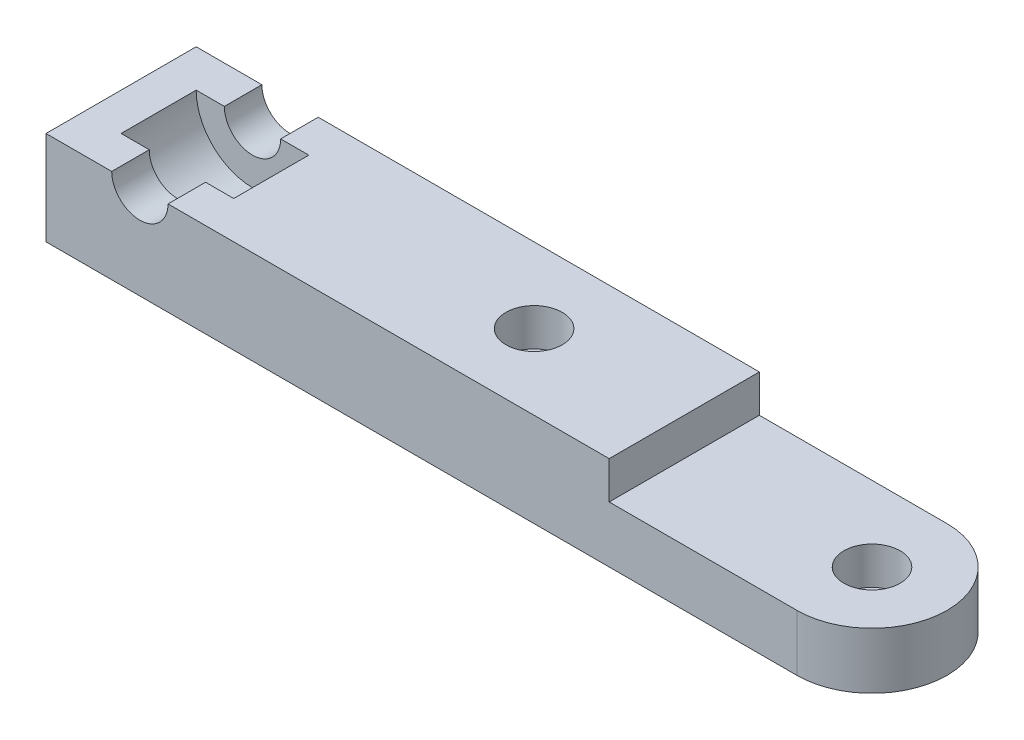
ISO-10303-21;
HEADER;
FILE_DESCRIPTION(('STEP AP214'),'2;1');
FILE_NAME('part.step','',(''),(''),'','','');
FILE_SCHEMA(('AUTOMOTIVE_DESIGN { 1 0 10303 214 1 1 1 1 }'));
ENDSEC;
DATA;
#1=APPLICATION_CONTEXT('core data for automotive mechanical design processes');
#2=APPLICATION_PROTOCOL_DEFINITION('international standard','automotive_design',2000,#1);
#3=PRODUCT_CONTEXT('',#1,'mechanical');
#4=PRODUCT('Part','Part','',(#3));
#5=PRODUCT_RELATED_PRODUCT_CATEGORY('part','',(#4));
#6=PRODUCT_DEFINITION_FORMATION('','',#4);
#7=PRODUCT_DEFINITION_CONTEXT('part definition',#1,'design');
#8=PRODUCT_DEFINITION('design','',#6,#7);
#9=PRODUCT_DEFINITION_SHAPE('','',#8);
#10=(LENGTH_UNIT() NAMED_UNIT(*) SI_UNIT(.MILLI.,.METRE.));
#11=(NAMED_UNIT(*) PLANE_ANGLE_UNIT() SI_UNIT($,.RADIAN.));
#12=(NAMED_UNIT(*) SI_UNIT($,.STERADIAN.) SOLID_ANGLE_UNIT());
#13=UNCERTAINTY_MEASURE_WITH_UNIT(LENGTH_MEASURE(1.E-05),#10,'distance_accuracy_value','');
#14=(GEOMETRIC_REPRESENTATION_CONTEXT(3) GLOBAL_UNCERTAINTY_ASSIGNED_CONTEXT((#13)) GLOBAL_UNIT_ASSIGNED_CONTEXT((#10,
#11,#12)) REPRESENTATION_CONTEXT('',''));
#15=CARTESIAN_POINT('',(0.,0.,0.));
#16=DIRECTION('',(0.,0.,1.));
#17=DIRECTION('',(1.,0.,0.));
#18=AXIS2_PLACEMENT_3D('',#15,#16,#17);
#19=CARTESIAN_POINT('',(30.,5.,-4.00004999999999));
#20=DIRECTION('',(0.,0.,1.));
#21=DIRECTION('',(1.,0.,0.));
#22=AXIS2_PLACEMENT_3D('',#19,#20,#21);
#23=CYLINDRICAL_SURFACE('',#22,1.5);
#24=CARTESIAN_POINT('',(30.,5.,-2.));
#25=DIRECTION('',(0.,0.,1.));
#26=DIRECTION('',(1.,0.,0.));
#27=AXIS2_PLACEMENT_3D('',#24,#25,#26);
#28=CIRCLE('',#27,1.5);
#29=CARTESIAN_POINT('',(31.5,5.,-2.));
#30=VERTEX_POINT('',#29);
#31=CARTESIAN_POINT('',(28.5,5.,-2.));
#32=VERTEX_POINT('',#31);
#33=EDGE_CURVE('E43',#30,#32,#28,.F.);
#34=ORIENTED_EDGE('',*,*,#33,.F.);
#35=DIRECTION('',(0.,0.,1.));
#36=VECTOR('',#35,1.);
#37=CARTESIAN_POINT('',(31.5,5.,-4.00004999999999));
#38=LINE('',#37,#36);
#39=CARTESIAN_POINT('',(31.5,5.,-3.99999999999999));
#40=VERTEX_POINT('',#39);
#41=EDGE_CURVE('E145',#30,#40,#38,.F.);
#42=ORIENTED_EDGE('',*,*,#41,.T.);
#43=CARTESIAN_POINT('',(30.,5.,-4.));
#44=DIRECTION('',(0.,0.,1.));
#45=DIRECTION('',(1.,0.,0.));
#46=AXIS2_PLACEMENT_3D('',#43,#44,#45);
#47=CIRCLE('',#46,1.5);
#48=CARTESIAN_POINT('',(28.5,5.,-3.99999999999999));
#49=VERTEX_POINT('',#48);
#50=EDGE_CURVE('E155',#49,#40,#47,.T.);
#51=ORIENTED_EDGE('',*,*,#50,.F.);
#52=DIRECTION('',(0.,0.,1.));
#53=VECTOR('',#52,1.);
#54=CARTESIAN_POINT('',(28.5,5.,-4.00004999999999));
#55=LINE('',#54,#53);
#56=EDGE_CURVE('E196',#49,#32,#55,.T.);
#57=ORIENTED_EDGE('',*,*,#56,.T.);
#58=EDGE_LOOP('',(#34,#42,#51,#57));
#59=FACE_BOUND('',#58,.T.);
#60=ADVANCED_FACE('F35',(#59),#23,.F.);
#61=CARTESIAN_POINT('',(0.,5.,0.));
#62=DIRECTION('',(0.,1.,0.));
#63=DIRECTION('',(0.,0.,1.));
#64=AXIS2_PLACEMENT_3D('',#61,#62,#63);
#65=PLANE('',#64);
#66=DIRECTION('',(-1.,0.,0.));
#67=VECTOR('',#66,1.);
#68=CARTESIAN_POINT('',(27.,5.,2.));
#69=LINE('',#68,#67);
#70=CARTESIAN_POINT('',(28.5,5.,2.));
#71=VERTEX_POINT('',#70);
#72=CARTESIAN_POINT('',(27.,5.,2.));
#73=VERTEX_POINT('',#72);
#74=EDGE_CURVE('E147',#71,#73,#69,.T.);
#75=ORIENTED_EDGE('',*,*,#74,.T.);
#76=DIRECTION('',(0.,0.,-1.));
#77=VECTOR('',#76,1.);
#78=CARTESIAN_POINT('',(27.,5.,2.));
#79=LINE('',#78,#77);
#80=CARTESIAN_POINT('',(27.,5.,-2.));
#81=VERTEX_POINT('',#80);
#82=EDGE_CURVE('E135',#73,#81,#79,.T.);
#83=ORIENTED_EDGE('',*,*,#82,.T.);
#84=DIRECTION('',(-1.,0.,0.));
#85=VECTOR('',#84,1.);
#86=CARTESIAN_POINT('',(27.,5.,-2.));
#87=LINE('',#86,#85);
#88=EDGE_CURVE('E139',#32,#81,#87,.T.);
#89=ORIENTED_EDGE('',*,*,#88,.F.);
#90=ORIENTED_EDGE('',*,*,#56,.F.);
#91=DIRECTION('',(-1.,0.,0.));
#92=VECTOR('',#91,1.);
#93=CARTESIAN_POINT('',(25.,5.,-3.99999999999999));
#94=LINE('',#93,#92);
#95=CARTESIAN_POINT('',(25.,5.,-3.99999999999999));
#96=VERTEX_POINT('',#95);
#97=EDGE_CURVE('E168',#49,#96,#94,.T.);
#98=ORIENTED_EDGE('',*,*,#97,.T.);
#99=DIRECTION('',(0.,0.,1.));
#100=VECTOR('',#99,1.);
#101=CARTESIAN_POINT('',(25.,5.,-3.99999999999999));
#102=LINE('',#101,#100);
#103=CARTESIAN_POINT('',(25.,5.,4.));
#104=VERTEX_POINT('',#103);
#105=EDGE_CURVE('E159',#96,#104,#102,.T.);
#106=ORIENTED_EDGE('',*,*,#105,.T.);
#107=DIRECTION('',(1.,0.,0.));
#108=VECTOR('',#107,1.);
#109=CARTESIAN_POINT('',(25.,5.,4.));
#110=LINE('',#109,#108);
#111=CARTESIAN_POINT('',(28.5,5.,4.));
#112=VERTEX_POINT('',#111);
#113=EDGE_CURVE('E163',#104,#112,#110,.T.);
#114=ORIENTED_EDGE('',*,*,#113,.T.);
#115=EDGE_CURVE('E195',#71,#112,#55,.T.);
#116=ORIENTED_EDGE('',*,*,#115,.F.);
#117=EDGE_LOOP('',(#75,#83,#89,#90,#98,#106,#114,#116));
#118=FACE_BOUND('',#117,.T.);
#119=ADVANCED_FACE('F202',(#118),#65,.T.);
#120=CARTESIAN_POINT('',(25.,3.,-3.99999999999999));
#121=DIRECTION('',(1.,0.,0.));
#122=DIRECTION('',(0.,0.,-1.));
#123=AXIS2_PLACEMENT_3D('',#120,#121,#122);
#124=PLANE('',#123);
#125=DIRECTION('',(0.,0.,1.));
#126=VECTOR('',#125,1.);
#127=CARTESIAN_POINT('',(25.,0.,-3.99999999999999));
#128=LINE('',#127,#126);
#129=CARTESIAN_POINT('',(25.,0.,-3.99999999999999));
#130=VERTEX_POINT('',#129);
#131=CARTESIAN_POINT('',(25.,0.,4.));
#132=VERTEX_POINT('',#131);
#133=EDGE_CURVE('E190',#130,#132,#128,.T.);
#134=ORIENTED_EDGE('',*,*,#133,.T.);
#135=DIRECTION('',(0.,-1.,0.));
#136=VECTOR('',#135,1.);
#137=CARTESIAN_POINT('',(25.,3.,4.));
#138=LINE('',#137,#136);
#139=EDGE_CURVE('E240',#104,#132,#138,.T.);
#140=ORIENTED_EDGE('',*,*,#139,.F.);
#141=ORIENTED_EDGE('',*,*,#105,.F.);
#142=DIRECTION('',(0.,-1.,0.));
#143=VECTOR('',#142,1.);
#144=CARTESIAN_POINT('',(25.,3.,-3.99999999999999));
#145=LINE('',#144,#143);
#146=EDGE_CURVE('E220',#96,#130,#145,.T.);
#147=ORIENTED_EDGE('',*,*,#146,.T.);
#148=EDGE_LOOP('',(#134,#140,#141,#147));
#149=FACE_BOUND('',#148,.T.);
#150=ADVANCED_FACE('F37',(#149),#124,.F.);
#151=CARTESIAN_POINT('',(25.,3.,4.));
#152=DIRECTION('',(0.,0.,-1.));
#153=DIRECTION('',(-1.,0.,0.));
#154=AXIS2_PLACEMENT_3D('',#151,#152,#153);
#155=PLANE('',#154);
#156=CARTESIAN_POINT('',(31.5,5.,4.));
#157=VERTEX_POINT('',#156);
#158=CARTESIAN_POINT('',(55.,5.,4.));
#159=VERTEX_POINT('',#158);
#160=EDGE_CURVE('E162',#157,#159,#110,.T.);
#161=ORIENTED_EDGE('',*,*,#160,.F.);
#162=CARTESIAN_POINT('',(30.,5.,4.));
#163=DIRECTION('',(0.,0.,1.));
#164=DIRECTION('',(-1.,0.,0.));
#165=AXIS2_PLACEMENT_3D('',#162,#163,#164);
#166=CIRCLE('',#165,1.5);
#167=EDGE_CURVE('E58',#112,#157,#166,.T.);
#168=ORIENTED_EDGE('',*,*,#167,.F.);
#169=ORIENTED_EDGE('',*,*,#113,.F.);
#170=ORIENTED_EDGE('',*,*,#139,.T.);
#171=DIRECTION('',(1.,0.,0.));
#172=VECTOR('',#171,1.);
#173=CARTESIAN_POINT('',(25.,0.,4.));
#174=LINE('',#173,#172);
#175=CARTESIAN_POINT('',(65.,0.,4.));
#176=VERTEX_POINT('',#175);
#177=EDGE_CURVE('E231',#132,#176,#174,.T.);
#178=ORIENTED_EDGE('',*,*,#177,.T.);
#179=DIRECTION('',(0.,-1.,0.));
#180=VECTOR('',#179,1.);
#181=CARTESIAN_POINT('',(65.,3.,4.));
#182=LINE('',#181,#180);
#183=CARTESIAN_POINT('',(65.,3.,4.));
#184=VERTEX_POINT('',#183);
#185=EDGE_CURVE('E237',#184,#176,#182,.T.);
#186=ORIENTED_EDGE('',*,*,#185,.F.);
#187=DIRECTION('',(1.,0.,0.));
#188=VECTOR('',#187,1.);
#189=CARTESIAN_POINT('',(25.,3.,4.));
#190=LINE('',#189,#188);
#191=CARTESIAN_POINT('',(55.,3.,4.));
#192=VERTEX_POINT('',#191);
#193=EDGE_CURVE('E224',#192,#184,#190,.T.);
#194=ORIENTED_EDGE('',*,*,#193,.F.);
#195=DIRECTION('',(0.,-1.,0.));
#196=VECTOR('',#195,1.);
#197=CARTESIAN_POINT('',(55.,5.,4.));
#198=LINE('',#197,#196);
#199=EDGE_CURVE('E185',#159,#192,#198,.T.);
#200=ORIENTED_EDGE('',*,*,#199,.F.);
#201=EDGE_LOOP('',(#161,#168,#169,#170,#178,#186,#194,#200));
#202=FACE_BOUND('',#201,.T.);
#203=ADVANCED_FACE('F244',(#202),#155,.F.);
#204=CARTESIAN_POINT('',(65.,3.,0.));
#205=DIRECTION('',(0.,-1.,0.));
#206=DIRECTION('',(0.,0.,-1.));
#207=AXIS2_PLACEMENT_3D('',#204,#205,#206);
#208=CYLINDRICAL_SURFACE('',#207,4.);
#209=CARTESIAN_POINT('',(65.,0.,0.));
#210=DIRECTION('',(0.,1.,0.));
#211=DIRECTION('',(0.,0.,1.));
#212=AXIS2_PLACEMENT_3D('',#209,#210,#211);
#213=CIRCLE('',#212,4.);
#214=CARTESIAN_POINT('',(65.,0.,-4.));
#215=VERTEX_POINT('',#214);
#216=EDGE_CURVE('E233',#176,#215,#213,.T.);
#217=ORIENTED_EDGE('',*,*,#216,.T.);
#218=DIRECTION('',(0.,-1.,0.));
#219=VECTOR('',#218,1.);
#220=CARTESIAN_POINT('',(65.,3.,-4.));
#221=LINE('',#220,#219);
#222=CARTESIAN_POINT('',(65.,3.,-4.));
#223=VERTEX_POINT('',#222);
#224=EDGE_CURVE('E217',#223,#215,#221,.T.);
#225=ORIENTED_EDGE('',*,*,#224,.F.);
#226=CARTESIAN_POINT('',(65.,3.,0.));
#227=DIRECTION('',(0.,1.,0.));
#228=DIRECTION('',(0.,0.,1.));
#229=AXIS2_PLACEMENT_3D('',#226,#227,#228);
#230=CIRCLE('',#229,4.);
#231=EDGE_CURVE('E221',#184,#223,#230,.T.);
#232=ORIENTED_EDGE('',*,*,#231,.F.);
#233=ORIENTED_EDGE('',*,*,#185,.T.);
#234=EDGE_LOOP('',(#217,#225,#232,#233));
#235=FACE_BOUND('',#234,.T.);
#236=ADVANCED_FACE('F253',(#235),#208,.T.);
#237=CARTESIAN_POINT('',(65.,3.,-4.));
#238=DIRECTION('',(0.,0.,1.));
#239=DIRECTION('',(1.,0.,0.));
#240=AXIS2_PLACEMENT_3D('',#237,#238,#239);
#241=PLANE('',#240);
#242=ORIENTED_EDGE('',*,*,#97,.F.);
#243=ORIENTED_EDGE('',*,*,#50,.T.);
#244=CARTESIAN_POINT('',(55.,5.,-3.99999999999999));
#245=VERTEX_POINT('',#244);
#246=EDGE_CURVE('E169',#245,#40,#94,.T.);
#247=ORIENTED_EDGE('',*,*,#246,.F.);
#248=DIRECTION('',(0.,-1.,0.));
#249=VECTOR('',#248,1.);
#250=CARTESIAN_POINT('',(55.,5.,-3.99999999999999));
#251=LINE('',#250,#249);
#252=CARTESIAN_POINT('',(55.,3.,-3.99999999999999));
#253=VERTEX_POINT('',#252);
#254=EDGE_CURVE('E171',#245,#253,#251,.T.);
#255=ORIENTED_EDGE('',*,*,#254,.T.);
#256=DIRECTION('',(-1.,0.,0.));
#257=VECTOR('',#256,1.);
#258=CARTESIAN_POINT('',(65.,3.,-4.));
#259=LINE('',#258,#257);
#260=EDGE_CURVE('E180',#223,#253,#259,.T.);
#261=ORIENTED_EDGE('',*,*,#260,.F.);
#262=ORIENTED_EDGE('',*,*,#224,.T.);
#263=DIRECTION('',(-1.,0.,0.));
#264=VECTOR('',#263,1.);
#265=CARTESIAN_POINT('',(65.,0.,-4.));
#266=LINE('',#265,#264);
#267=EDGE_CURVE('E226',#215,#130,#266,.T.);
#268=ORIENTED_EDGE('',*,*,#267,.T.);
#269=ORIENTED_EDGE('',*,*,#146,.F.);
#270=EDGE_LOOP('',(#242,#243,#247,#255,#261,#262,#268,#269));
#271=FACE_BOUND('',#270,.T.);
#272=ADVANCED_FACE('F206',(#271),#241,.F.);
#273=CARTESIAN_POINT('',(65.,3.,0.));
#274=DIRECTION('',(0.,1.,0.));
#275=DIRECTION('',(0.,0.,1.));
#276=AXIS2_PLACEMENT_3D('',#273,#274,#275);
#277=PLANE('',#276);
#278=CARTESIAN_POINT('',(65.,3.,0.));
#279=DIRECTION('',(0.,1.,0.));
#280=DIRECTION('',(0.,0.,1.));
#281=AXIS2_PLACEMENT_3D('',#278,#279,#280);
#282=CIRCLE('',#281,1.5);
#283=CARTESIAN_POINT('',(65.,3.,1.5));
#284=VERTEX_POINT('',#283);
#285=EDGE_CURVE('E295',#284,#284,#282,.T.);
#286=ORIENTED_EDGE('',*,*,#285,.F.);
#287=EDGE_LOOP('',(#286));
#288=FACE_BOUND('',#287,.T.);
#289=DIRECTION('',(0.,0.,-1.));
#290=VECTOR('',#289,1.);
#291=CARTESIAN_POINT('',(55.,3.,-3.99999999999999));
#292=LINE('',#291,#290);
#293=EDGE_CURVE('E158',#192,#253,#292,.T.);
#294=ORIENTED_EDGE('',*,*,#293,.F.);
#295=ORIENTED_EDGE('',*,*,#193,.T.);
#296=ORIENTED_EDGE('',*,*,#231,.T.);
#297=ORIENTED_EDGE('',*,*,#260,.T.);
#298=EDGE_LOOP('',(#294,#295,#296,#297));
#299=FACE_BOUND('',#298,.T.);
#300=ADVANCED_FACE('F255',(#288,#299),#277,.T.);
#301=CARTESIAN_POINT('',(65.,0.,0.));
#302=DIRECTION('',(0.,1.,0.));
#303=DIRECTION('',(0.,0.,1.));
#304=AXIS2_PLACEMENT_3D('',#301,#302,#303);
#305=PLANE('',#304);
#306=ORIENTED_EDGE('',*,*,#133,.F.);
#307=ORIENTED_EDGE('',*,*,#267,.F.);
#308=ORIENTED_EDGE('',*,*,#216,.F.);
#309=ORIENTED_EDGE('',*,*,#177,.F.);
#310=EDGE_LOOP('',(#306,#307,#308,#309));
#311=FACE_BOUND('',#310,.T.);
#312=ADVANCED_FACE('F250',(#311),#305,.F.);
#313=CARTESIAN_POINT('',(55.,5.,-3.99999999999999));
#314=DIRECTION('',(-1.,0.,0.));
#315=DIRECTION('',(0.,0.,1.));
#316=AXIS2_PLACEMENT_3D('',#313,#314,#315);
#317=PLANE('',#316);
#318=ORIENTED_EDGE('',*,*,#293,.T.);
#319=ORIENTED_EDGE('',*,*,#254,.F.);
#320=DIRECTION('',(0.,0.,-1.));
#321=VECTOR('',#320,1.);
#322=CARTESIAN_POINT('',(55.,5.,-3.99999999999999));
#323=LINE('',#322,#321);
#324=EDGE_CURVE('E166',#159,#245,#323,.T.);
#325=ORIENTED_EDGE('',*,*,#324,.F.);
#326=ORIENTED_EDGE('',*,*,#199,.T.);
#327=EDGE_LOOP('',(#318,#319,#325,#326));
#328=FACE_BOUND('',#327,.T.);
#329=ADVANCED_FACE('F213',(#328),#317,.F.);
#330=CARTESIAN_POINT('',(47.,5.,0.));
#331=DIRECTION('',(0.,1.,0.));
#332=DIRECTION('',(0.,0.,1.));
#333=AXIS2_PLACEMENT_3D('',#330,#331,#332);
#334=CIRCLE('',#333,1.5);
#335=CARTESIAN_POINT('',(47.,5.,1.50000000000001));
#336=VERTEX_POINT('',#335);
#337=EDGE_CURVE('E290',#336,#336,#334,.T.);
#338=ORIENTED_EDGE('',*,*,#337,.F.);
#339=EDGE_LOOP('',(#338));
#340=FACE_BOUND('',#339,.T.);
#341=CARTESIAN_POINT('',(33.,5.,2.));
#342=VERTEX_POINT('',#341);
#343=CARTESIAN_POINT('',(31.5,5.,2.));
#344=VERTEX_POINT('',#343);
#345=EDGE_CURVE('E151',#342,#344,#69,.T.);
#346=ORIENTED_EDGE('',*,*,#345,.T.);
#347=EDGE_CURVE('E193',#157,#344,#38,.F.);
#348=ORIENTED_EDGE('',*,*,#347,.F.);
#349=ORIENTED_EDGE('',*,*,#160,.T.);
#350=ORIENTED_EDGE('',*,*,#324,.T.);
#351=ORIENTED_EDGE('',*,*,#246,.T.);
#352=ORIENTED_EDGE('',*,*,#41,.F.);
#353=CARTESIAN_POINT('',(33.,5.,-2.));
#354=VERTEX_POINT('',#353);
#355=EDGE_CURVE('E50',#354,#30,#87,.T.);
#356=ORIENTED_EDGE('',*,*,#355,.F.);
#357=DIRECTION('',(0.,0.,-1.));
#358=VECTOR('',#357,1.);
#359=CARTESIAN_POINT('',(33.,5.,2.));
#360=LINE('',#359,#358);
#361=EDGE_CURVE('E127',#342,#354,#360,.T.);
#362=ORIENTED_EDGE('',*,*,#361,.F.);
#363=EDGE_LOOP('',(#346,#348,#349,#350,#351,#352,#356,#362));
#364=FACE_BOUND('',#363,.T.);
#365=ADVANCED_FACE('F143',(#340,#364),#65,.T.);
#366=ORIENTED_EDGE('',*,*,#347,.T.);
#367=CARTESIAN_POINT('',(30.,5.,2.));
#368=DIRECTION('',(0.,0.,1.));
#369=DIRECTION('',(1.,0.,0.));
#370=AXIS2_PLACEMENT_3D('',#367,#368,#369);
#371=CIRCLE('',#370,1.5);
#372=EDGE_CURVE('E11',#344,#71,#371,.F.);
#373=ORIENTED_EDGE('',*,*,#372,.T.);
#374=ORIENTED_EDGE('',*,*,#115,.T.);
#375=ORIENTED_EDGE('',*,*,#167,.T.);
#376=EDGE_LOOP('',(#366,#373,#374,#375));
#377=FACE_BOUND('',#376,.T.);
#378=ADVANCED_FACE('F269',(#377),#23,.F.);
#379=CARTESIAN_POINT('',(30.,5.,2.));
#380=DIRECTION('',(0.,0.,1.));
#381=DIRECTION('',(1.,0.,0.));
#382=AXIS2_PLACEMENT_3D('',#379,#380,#381);
#383=PLANE('',#382);
#384=ORIENTED_EDGE('',*,*,#345,.F.);
#385=CARTESIAN_POINT('',(30.,5.,2.));
#386=DIRECTION('',(0.,0.,1.));
#387=DIRECTION('',(1.,0.,0.));
#388=AXIS2_PLACEMENT_3D('',#385,#386,#387);
#389=CIRCLE('',#388,3.);
#390=EDGE_CURVE('E132',#73,#342,#389,.T.);
#391=ORIENTED_EDGE('',*,*,#390,.F.);
#392=ORIENTED_EDGE('',*,*,#74,.F.);
#393=ORIENTED_EDGE('',*,*,#372,.F.);
#394=EDGE_LOOP('',(#384,#391,#392,#393));
#395=FACE_BOUND('',#394,.T.);
#396=ADVANCED_FACE('F276',(#395),#383,.F.);
#397=CARTESIAN_POINT('',(30.,5.,-2.));
#398=DIRECTION('',(0.,0.,1.));
#399=DIRECTION('',(1.,0.,0.));
#400=AXIS2_PLACEMENT_3D('',#397,#398,#399);
#401=PLANE('',#400);
#402=ORIENTED_EDGE('',*,*,#33,.T.);
#403=ORIENTED_EDGE('',*,*,#88,.T.);
#404=CARTESIAN_POINT('',(30.,5.,-2.));
#405=DIRECTION('',(0.,0.,1.));
#406=DIRECTION('',(1.,0.,0.));
#407=AXIS2_PLACEMENT_3D('',#404,#405,#406);
#408=CIRCLE('',#407,3.);
#409=EDGE_CURVE('E129',#81,#354,#408,.T.);
#410=ORIENTED_EDGE('',*,*,#409,.T.);
#411=ORIENTED_EDGE('',*,*,#355,.T.);
#412=EDGE_LOOP('',(#402,#403,#410,#411));
#413=FACE_BOUND('',#412,.T.);
#414=ADVANCED_FACE('F137',(#413),#401,.T.);
#415=CARTESIAN_POINT('',(30.,5.,2.));
#416=DIRECTION('',(0.,0.,-1.));
#417=DIRECTION('',(-1.,0.,0.));
#418=AXIS2_PLACEMENT_3D('',#415,#416,#417);
#419=CYLINDRICAL_SURFACE('',#418,3.);
#420=ORIENTED_EDGE('',*,*,#82,.F.);
#421=ORIENTED_EDGE('',*,*,#390,.T.);
#422=ORIENTED_EDGE('',*,*,#361,.T.);
#423=ORIENTED_EDGE('',*,*,#409,.F.);
#424=EDGE_LOOP('',(#420,#421,#422,#423));
#425=FACE_BOUND('',#424,.T.);
#426=ADVANCED_FACE('F128',(#425),#419,.F.);
#427=CARTESIAN_POINT('',(65.,1.,0.));
#428=DIRECTION('',(0.,1.,0.));
#429=DIRECTION('',(0.,0.,1.));
#430=AXIS2_PLACEMENT_3D('',#427,#428,#429);
#431=CYLINDRICAL_SURFACE('',#430,1.5);
#432=CARTESIAN_POINT('',(65.,1.,0.));
#433=DIRECTION('',(0.,1.,0.));
#434=DIRECTION('',(0.,0.,1.));
#435=AXIS2_PLACEMENT_3D('',#432,#433,#434);
#436=CIRCLE('',#435,1.5);
#437=CARTESIAN_POINT('',(65.,1.,1.5));
#438=VERTEX_POINT('',#437);
#439=EDGE_CURVE('E140',#438,#438,#436,.T.);
#440=ORIENTED_EDGE('',*,*,#439,.F.);
#441=EDGE_LOOP('',(#440));
#442=FACE_BOUND('',#441,.T.);
#443=ORIENTED_EDGE('',*,*,#285,.T.);
#444=EDGE_LOOP('',(#443));
#445=FACE_BOUND('',#444,.T.);
#446=ADVANCED_FACE('F301',(#442,#445),#431,.F.);
#447=CARTESIAN_POINT('',(65.,1.,0.));
#448=DIRECTION('',(0.,1.,0.));
#449=DIRECTION('',(0.,0.,1.));
#450=AXIS2_PLACEMENT_3D('',#447,#448,#449);
#451=PLANE('',#450);
#452=ORIENTED_EDGE('',*,*,#439,.T.);
#453=EDGE_LOOP('',(#452));
#454=FACE_BOUND('',#453,.T.);
#455=ADVANCED_FACE('F303',(#454),#451,.T.);
#456=CARTESIAN_POINT('',(47.,3.,0.));
#457=DIRECTION('',(0.,1.,0.));
#458=DIRECTION('',(0.,0.,1.));
#459=AXIS2_PLACEMENT_3D('',#456,#457,#458);
#460=CYLINDRICAL_SURFACE('',#459,1.5);
#461=CARTESIAN_POINT('',(47.,3.,0.));
#462=DIRECTION('',(0.,1.,0.));
#463=DIRECTION('',(0.,0.,1.));
#464=AXIS2_PLACEMENT_3D('',#461,#462,#463);
#465=CIRCLE('',#464,1.5);
#466=CARTESIAN_POINT('',(47.,3.,1.50000000000001));
#467=VERTEX_POINT('',#466);
#468=EDGE_CURVE('E292',#467,#467,#465,.T.);
#469=ORIENTED_EDGE('',*,*,#468,.F.);
#470=EDGE_LOOP('',(#469));
#471=FACE_BOUND('',#470,.T.);
#472=ORIENTED_EDGE('',*,*,#337,.T.);
#473=EDGE_LOOP('',(#472));
#474=FACE_BOUND('',#473,.T.);
#475=ADVANCED_FACE('F310',(#471,#474),#460,.F.);
#476=CARTESIAN_POINT('',(47.,3.,0.));
#477=DIRECTION('',(0.,1.,0.));
#478=DIRECTION('',(0.,0.,1.));
#479=AXIS2_PLACEMENT_3D('',#476,#477,#478);
#480=PLANE('',#479);
#481=ORIENTED_EDGE('',*,*,#468,.T.);
#482=EDGE_LOOP('',(#481));
#483=FACE_BOUND('',#482,.T.);
#484=ADVANCED_FACE('F356',(#483),#480,.T.);
#485=CLOSED_SHELL('',(#60,#119,#150,#203,#236,#272,#300,#312,#329,#365,#378,#396,#414,#426,#446,
#455,#475,#484));
#486=MANIFOLD_SOLID_BREP('B2',#485);
#487=ADVANCED_BREP_SHAPE_REPRESENTATION('',(#18,#486),#14);
#488=SHAPE_DEFINITION_REPRESENTATION(#9,#487);
ENDSEC;
END-ISO-10303-21;
